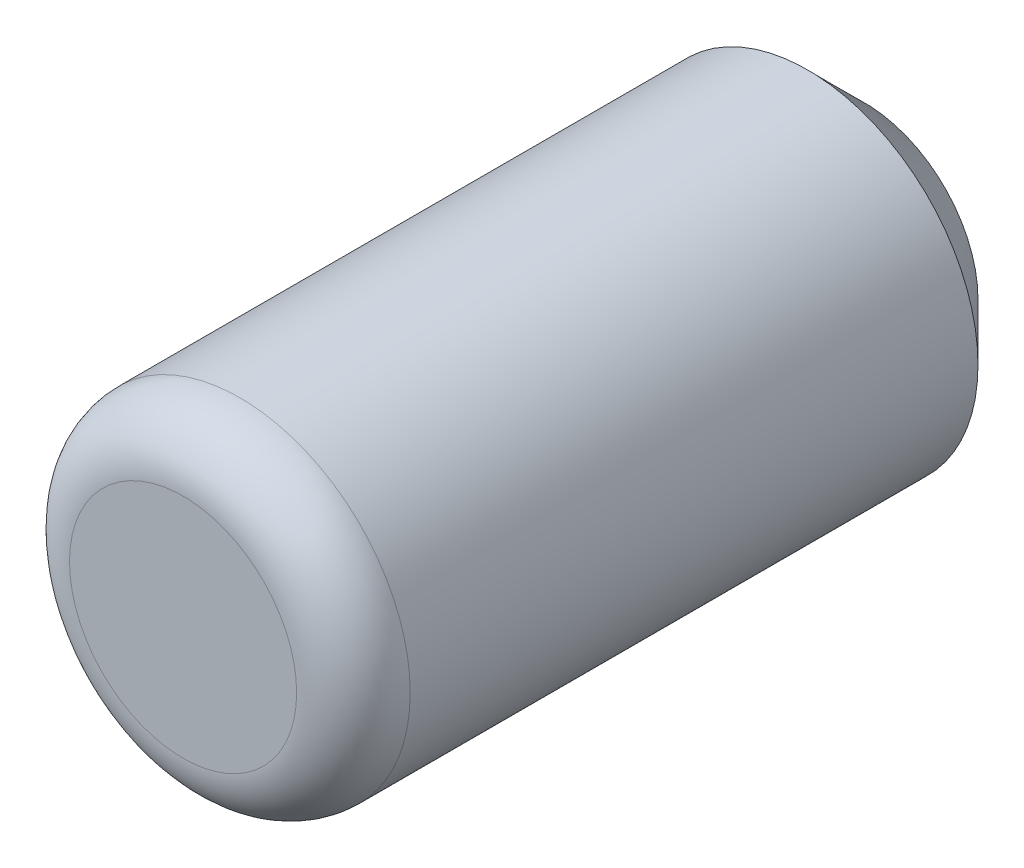
ISO-10303-21;
HEADER;
FILE_DESCRIPTION(('STEP AP214'),'2;1');
FILE_NAME('part.step','',(''),(''),'','','');
FILE_SCHEMA(('AUTOMOTIVE_DESIGN { 1 0 10303 214 1 1 1 1 }'));
ENDSEC;
DATA;
#1=APPLICATION_CONTEXT('core data for automotive mechanical design processes');
#2=APPLICATION_PROTOCOL_DEFINITION('international standard','automotive_design',2000,#1);
#3=PRODUCT_CONTEXT('',#1,'mechanical');
#4=PRODUCT('Part','Part','',(#3));
#5=PRODUCT_RELATED_PRODUCT_CATEGORY('part','',(#4));
#6=PRODUCT_DEFINITION_FORMATION('','',#4);
#7=PRODUCT_DEFINITION_CONTEXT('part definition',#1,'design');
#8=PRODUCT_DEFINITION('design','',#6,#7);
#9=PRODUCT_DEFINITION_SHAPE('','',#8);
#10=(LENGTH_UNIT() NAMED_UNIT(*) SI_UNIT(.MILLI.,.METRE.));
#11=(NAMED_UNIT(*) PLANE_ANGLE_UNIT() SI_UNIT($,.RADIAN.));
#12=(NAMED_UNIT(*) SI_UNIT($,.STERADIAN.) SOLID_ANGLE_UNIT());
#13=UNCERTAINTY_MEASURE_WITH_UNIT(LENGTH_MEASURE(1.E-05),#10,'distance_accuracy_value','');
#14=(GEOMETRIC_REPRESENTATION_CONTEXT(3) GLOBAL_UNCERTAINTY_ASSIGNED_CONTEXT((#13)) GLOBAL_UNIT_ASSIGNED_CONTEXT((#10,
#11,#12)) REPRESENTATION_CONTEXT('',''));
#15=CARTESIAN_POINT('',(0.,0.,0.));
#16=DIRECTION('',(0.,0.,1.));
#17=DIRECTION('',(1.,0.,0.));
#18=AXIS2_PLACEMENT_3D('',#15,#16,#17);
#19=CARTESIAN_POINT('',(0.,0.,4.7625));
#20=DIRECTION('',(0.,0.,-1.));
#21=DIRECTION('',(-1.,0.,0.));
#22=AXIS2_PLACEMENT_3D('',#19,#20,#21);
#23=CYLINDRICAL_SURFACE('',#22,2.38125);
#24=CARTESIAN_POINT('',(0.,0.,-3.96874999999999));
#25=DIRECTION('',(0.,0.,1.));
#26=DIRECTION('',(1.,0.,0.));
#27=AXIS2_PLACEMENT_3D('',#24,#25,#26);
#28=CIRCLE('',#27,2.38125);
#29=CARTESIAN_POINT('',(-2.38125,0.,-3.96874999999999));
#30=VERTEX_POINT('',#29);
#31=EDGE_CURVE('E37',#30,#30,#28,.T.);
#32=CARTESIAN_POINT('',(0.,0.,3.96875));
#33=DIRECTION('',(0.,0.,1.));
#34=DIRECTION('',(1.,0.,0.));
#35=AXIS2_PLACEMENT_3D('',#32,#33,#34);
#36=CIRCLE('',#35,2.38125);
#37=CARTESIAN_POINT('',(-2.38125,0.,3.96875));
#38=VERTEX_POINT('',#37);
#39=EDGE_CURVE('E41',#38,#38,#36,.F.);
#40=CARTESIAN_POINT('',(-2.38125,0.,-3.96874999999999));
#41=CARTESIAN_POINT('',(-2.38125,0.,-3.88606770833333));
#42=CARTESIAN_POINT('',(-2.38125,0.,-3.80338541666666));
#43=CARTESIAN_POINT('',(-2.38125,0.,-3.63802083333333));
#44=CARTESIAN_POINT('',(-2.38125,0.,-3.55533854166666));
#45=CARTESIAN_POINT('',(-2.38125,0.,-3.38997395833333));
#46=CARTESIAN_POINT('',(-2.38125,0.,-3.30729166666666));
#47=CARTESIAN_POINT('',(-2.38125,0.,-3.14192708333333));
#48=CARTESIAN_POINT('',(-2.38125,0.,-3.05924479166666));
#49=CARTESIAN_POINT('',(-2.38125,0.,-2.89388020833333));
#50=CARTESIAN_POINT('',(-2.38125,0.,-2.81119791666666));
#51=CARTESIAN_POINT('',(-2.38125,0.,-2.64583333333333));
#52=CARTESIAN_POINT('',(-2.38125,0.,-2.56315104166666));
#53=CARTESIAN_POINT('',(-2.38125,0.,-2.39778645833333));
#54=CARTESIAN_POINT('',(-2.38125,0.,-2.31510416666666));
#55=CARTESIAN_POINT('',(-2.38125,0.,-2.14973958333333));
#56=CARTESIAN_POINT('',(-2.38125,0.,-2.06705729166666));
#57=CARTESIAN_POINT('',(-2.38125,0.,-1.90169270833333));
#58=CARTESIAN_POINT('',(-2.38125,0.,-1.81901041666666));
#59=CARTESIAN_POINT('',(-2.38125,0.,-1.65364583333333));
#60=CARTESIAN_POINT('',(-2.38125,0.,-1.57096354166666));
#61=CARTESIAN_POINT('',(-2.38125,0.,-1.40559895833333));
#62=CARTESIAN_POINT('',(-2.38125,0.,-1.32291666666666));
#63=CARTESIAN_POINT('',(-2.38125,0.,-1.15755208333333));
#64=CARTESIAN_POINT('',(-2.38125,0.,-1.07486979166666));
#65=CARTESIAN_POINT('',(-2.38125,0.,-0.90950520833333));
#66=CARTESIAN_POINT('',(-2.38125,0.,-0.826822916666664));
#67=CARTESIAN_POINT('',(-2.38125,0.,-0.66145833333333));
#68=CARTESIAN_POINT('',(-2.38125,0.,-0.578776041666664));
#69=CARTESIAN_POINT('',(-2.38125,0.,-0.413411458333331));
#70=CARTESIAN_POINT('',(-2.38125,0.,-0.330729166666664));
#71=CARTESIAN_POINT('',(-2.38125,0.,-0.165364583333331));
#72=CARTESIAN_POINT('',(-2.38125,0.,-0.0826822916666642));
#73=CARTESIAN_POINT('',(-2.38125,0.,0.0826822916666691));
#74=CARTESIAN_POINT('',(-2.38125,0.,0.165364583333336));
#75=CARTESIAN_POINT('',(-2.38125,0.,0.330729166666669));
#76=CARTESIAN_POINT('',(-2.38125,0.,0.413411458333336));
#77=CARTESIAN_POINT('',(-2.38125,0.,0.578776041666669));
#78=CARTESIAN_POINT('',(-2.38125,0.,0.661458333333336));
#79=CARTESIAN_POINT('',(-2.38125,0.,0.826822916666669));
#80=CARTESIAN_POINT('',(-2.38125,0.,0.909505208333335));
#81=CARTESIAN_POINT('',(-2.38125,0.,1.07486979166667));
#82=CARTESIAN_POINT('',(-2.38125,0.,1.15755208333333));
#83=CARTESIAN_POINT('',(-2.38125,0.,1.32291666666667));
#84=CARTESIAN_POINT('',(-2.38125,0.,1.40559895833333));
#85=CARTESIAN_POINT('',(-2.38125,0.,1.57096354166667));
#86=CARTESIAN_POINT('',(-2.38125,0.,1.65364583333333));
#87=CARTESIAN_POINT('',(-2.38125,0.,1.81901041666667));
#88=CARTESIAN_POINT('',(-2.38125,0.,1.90169270833333));
#89=CARTESIAN_POINT('',(-2.38125,0.,2.06705729166667));
#90=CARTESIAN_POINT('',(-2.38125,0.,2.14973958333333));
#91=CARTESIAN_POINT('',(-2.38125,0.,2.31510416666667));
#92=CARTESIAN_POINT('',(-2.38125,0.,2.39778645833333));
#93=CARTESIAN_POINT('',(-2.38125,0.,2.56315104166667));
#94=CARTESIAN_POINT('',(-2.38125,0.,2.64583333333333));
#95=CARTESIAN_POINT('',(-2.38125,0.,2.81119791666667));
#96=CARTESIAN_POINT('',(-2.38125,0.,2.89388020833333));
#97=CARTESIAN_POINT('',(-2.38125,0.,3.05924479166667));
#98=CARTESIAN_POINT('',(-2.38125,0.,3.14192708333333));
#99=CARTESIAN_POINT('',(-2.38125,0.,3.30729166666667));
#100=CARTESIAN_POINT('',(-2.38125,0.,3.38997395833333));
#101=CARTESIAN_POINT('',(-2.38125,0.,3.55533854166667));
#102=CARTESIAN_POINT('',(-2.38125,0.,3.63802083333333));
#103=CARTESIAN_POINT('',(-2.38125,0.,3.80338541666667));
#104=CARTESIAN_POINT('',(-2.38125,0.,3.88606770833333));
#105=CARTESIAN_POINT('',(-2.38125,0.,3.96875));
#106=B_SPLINE_CURVE_WITH_KNOTS('',3,(#40,#41,#42,#43,#44,#45,#46,#47,#48,#49,#50,#51,#52,#53,
#54,#55,#56,#57,#58,#59,#60,#61,#62,#63,#64,#65,#66,#67,#68,#69,#70,#71,#72,#73,#74,#75,#76,#77,
#78,#79,#80,#81,#82,#83,#84,#85,#86,#87,#88,#89,#90,#91,#92,#93,#94,#95,#96,#97,#98,#99,#100,
#101,#102,#103,#104,#105),.UNSPECIFIED.,.F.,.F.,(4,2,2,2,2,2,2,2,2,2,2,2,2,2,2,2,2,2,2,2,2,2,2,
2,2,2,2,2,2,2,2,2,4),(0.,0.248046875,0.496093749999999,0.744140625,0.992187499999998,
1.240234375,1.48828125,1.736328125,1.984375,2.232421875,2.48046875,2.728515625,2.9765625,
3.224609375,3.47265625,3.720703125,3.96875,4.216796875,4.46484375,4.712890625,4.96093749999999,
5.208984375,5.45703124999999,5.70507812499999,5.95312499999999,6.20117187499999,
6.44921874999999,6.69726562499999,6.94531249999999,7.19335937499999,7.44140624999999,
7.68945312499999,7.93749999999999),.UNSPECIFIED.);
#107=EDGE_CURVE('BSEAM30',#30,#38,#106,.T.);
#108=ORIENTED_EDGE('',*,*,#31,.T.);
#109=ORIENTED_EDGE('',*,*,#39,.T.);
#110=ORIENTED_EDGE('',*,*,#107,.T.);
#111=ORIENTED_EDGE('',*,*,#107,.F.);
#112=EDGE_LOOP('',(#108,#110,#109,#111));
#113=FACE_BOUND('',#112,.T.);
#114=ADVANCED_FACE('F30',(#113),#23,.T.);
#115=CARTESIAN_POINT('',(0.,0.,4.7625));
#116=DIRECTION('',(0.,0.,1.));
#117=DIRECTION('',(1.,0.,0.));
#118=AXIS2_PLACEMENT_3D('',#115,#116,#117);
#119=PLANE('',#118);
#120=CARTESIAN_POINT('',(0.,0.,4.7625));
#121=DIRECTION('',(0.,0.,1.));
#122=DIRECTION('',(1.,0.,0.));
#123=AXIS2_PLACEMENT_3D('',#120,#121,#122);
#124=CIRCLE('',#123,1.5875);
#125=CARTESIAN_POINT('',(1.5875,0.,4.7625));
#126=VERTEX_POINT('',#125);
#127=EDGE_CURVE('E45',#126,#126,#124,.T.);
#128=ORIENTED_EDGE('',*,*,#127,.T.);
#129=EDGE_LOOP('',(#128));
#130=FACE_BOUND('',#129,.T.);
#131=ADVANCED_FACE('F51',(#130),#119,.T.);
#132=CARTESIAN_POINT('',(0.,0.,-4.7625));
#133=DIRECTION('',(0.,0.,1.));
#134=DIRECTION('',(1.,0.,0.));
#135=AXIS2_PLACEMENT_3D('',#132,#133,#134);
#136=PLANE('',#135);
#137=CARTESIAN_POINT('',(0.,0.,-4.7625));
#138=DIRECTION('',(0.,0.,1.));
#139=DIRECTION('',(1.,0.,0.));
#140=AXIS2_PLACEMENT_3D('',#137,#138,#139);
#141=CIRCLE('',#140,1.58749999999999);
#142=CARTESIAN_POINT('',(1.58749999999999,0.,-4.7625));
#143=VERTEX_POINT('',#142);
#144=EDGE_CURVE('E10',#143,#143,#141,.F.);
#145=ORIENTED_EDGE('',*,*,#144,.T.);
#146=EDGE_LOOP('',(#145));
#147=FACE_BOUND('',#146,.T.);
#148=ADVANCED_FACE('F55',(#147),#136,.F.);
#149=CARTESIAN_POINT('',(0.,0.,3.96875));
#150=DIRECTION('',(0.,0.,1.));
#151=DIRECTION('',(1.,0.,0.));
#152=AXIS2_PLACEMENT_3D('',#149,#150,#151);
#153=TOROIDAL_SURFACE('',#152,1.5875,0.79375);
#154=ORIENTED_EDGE('',*,*,#39,.F.);
#155=EDGE_LOOP('',(#154));
#156=FACE_BOUND('',#155,.T.);
#157=ORIENTED_EDGE('',*,*,#127,.F.);
#158=EDGE_LOOP('',(#157));
#159=FACE_BOUND('',#158,.T.);
#160=ADVANCED_FACE('F53',(#156,#159),#153,.T.);
#161=CARTESIAN_POINT('',(0.,0.,-3.96874999999999));
#162=DIRECTION('',(0.,0.,1.));
#163=DIRECTION('',(1.,0.,0.));
#164=AXIS2_PLACEMENT_3D('',#161,#162,#163);
#165=CONICAL_SURFACE('',#164,2.38125,0.78539816339745);
#166=ORIENTED_EDGE('',*,*,#144,.F.);
#167=EDGE_LOOP('',(#166));
#168=FACE_BOUND('',#167,.T.);
#169=ORIENTED_EDGE('',*,*,#31,.F.);
#170=EDGE_LOOP('',(#169));
#171=FACE_BOUND('',#170,.T.);
#172=ADVANCED_FACE('F32',(#168,#171),#165,.T.);
#173=CLOSED_SHELL('',(#114,#131,#148,#160,#172));
#174=MANIFOLD_SOLID_BREP('B2',#173);
#175=ADVANCED_BREP_SHAPE_REPRESENTATION('',(#18,#174),#14);
#176=SHAPE_DEFINITION_REPRESENTATION(#9,#175);
ENDSEC;
END-ISO-10303-21;
